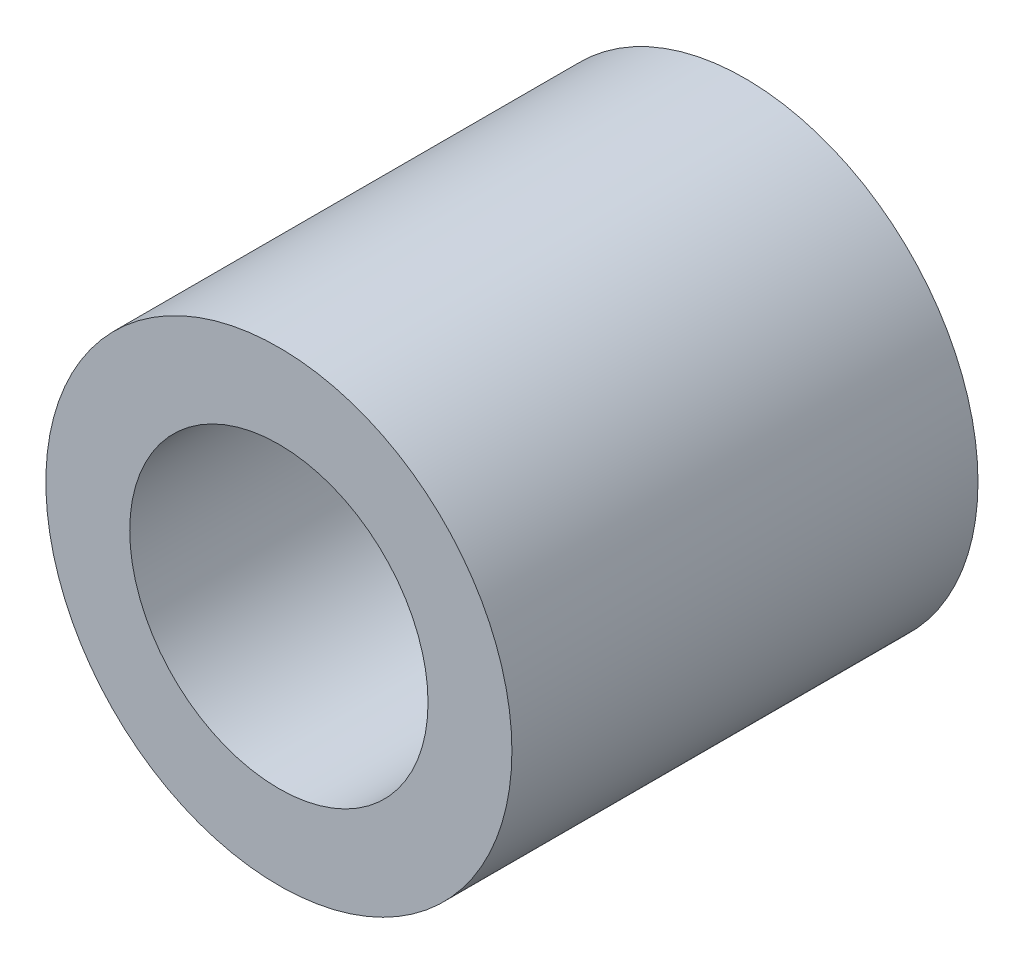
ISO-10303-21;
HEADER;
FILE_DESCRIPTION(('STEP AP214'),'2;1');
FILE_NAME('part.step','',(''),(''),'','','');
FILE_SCHEMA(('AUTOMOTIVE_DESIGN { 1 0 10303 214 1 1 1 1 }'));
ENDSEC;
DATA;
#1=APPLICATION_CONTEXT('core data for automotive mechanical design processes');
#2=APPLICATION_PROTOCOL_DEFINITION('international standard','automotive_design',2000,#1);
#3=PRODUCT_CONTEXT('',#1,'mechanical');
#4=PRODUCT('Part','Part','',(#3));
#5=PRODUCT_RELATED_PRODUCT_CATEGORY('part','',(#4));
#6=PRODUCT_DEFINITION_FORMATION('','',#4);
#7=PRODUCT_DEFINITION_CONTEXT('part definition',#1,'design');
#8=PRODUCT_DEFINITION('design','',#6,#7);
#9=PRODUCT_DEFINITION_SHAPE('','',#8);
#10=(LENGTH_UNIT() NAMED_UNIT(*) SI_UNIT(.MILLI.,.METRE.));
#11=(NAMED_UNIT(*) PLANE_ANGLE_UNIT() SI_UNIT($,.RADIAN.));
#12=(NAMED_UNIT(*) SI_UNIT($,.STERADIAN.) SOLID_ANGLE_UNIT());
#13=UNCERTAINTY_MEASURE_WITH_UNIT(LENGTH_MEASURE(1.E-05),#10,'distance_accuracy_value','');
#14=(GEOMETRIC_REPRESENTATION_CONTEXT(3) GLOBAL_UNCERTAINTY_ASSIGNED_CONTEXT((#13)) GLOBAL_UNIT_ASSIGNED_CONTEXT((#10,
#11,#12)) REPRESENTATION_CONTEXT('',''));
#15=CARTESIAN_POINT('',(0.,0.,0.));
#16=DIRECTION('',(0.,0.,1.));
#17=DIRECTION('',(1.,0.,0.));
#18=AXIS2_PLACEMENT_3D('',#15,#16,#17);
#19=CARTESIAN_POINT('',(0.,0.,5.));
#20=DIRECTION('',(0.,0.,1.));
#21=DIRECTION('',(1.,0.,0.));
#22=AXIS2_PLACEMENT_3D('',#19,#20,#21);
#23=PLANE('',#22);
#24=CARTESIAN_POINT('',(0.,0.,5.));
#25=DIRECTION('',(0.,0.,1.));
#26=DIRECTION('',(1.,0.,0.));
#27=AXIS2_PLACEMENT_3D('',#24,#25,#26);
#28=CIRCLE('',#27,2.5);
#29=CARTESIAN_POINT('',(2.5,0.,5.));
#30=VERTEX_POINT('',#29);
#31=EDGE_CURVE('E10',#30,#30,#28,.T.);
#32=ORIENTED_EDGE('',*,*,#31,.T.);
#33=EDGE_LOOP('',(#32));
#34=FACE_BOUND('',#33,.T.);
#35=CARTESIAN_POINT('',(0.,0.,5.));
#36=DIRECTION('',(0.,0.,1.));
#37=DIRECTION('',(1.,0.,0.));
#38=AXIS2_PLACEMENT_3D('',#35,#36,#37);
#39=CIRCLE('',#38,1.6);
#40=CARTESIAN_POINT('',(1.6,0.,5.));
#41=VERTEX_POINT('',#40);
#42=EDGE_CURVE('E58',#41,#41,#39,.T.);
#43=ORIENTED_EDGE('',*,*,#42,.F.);
#44=EDGE_LOOP('',(#43));
#45=FACE_BOUND('',#44,.T.);
#46=ADVANCED_FACE('F45',(#34,#45),#23,.T.);
#47=CARTESIAN_POINT('',(0.,0.,0.));
#48=DIRECTION('',(0.,0.,1.));
#49=DIRECTION('',(1.,0.,0.));
#50=AXIS2_PLACEMENT_3D('',#47,#48,#49);
#51=PLANE('',#50);
#52=CARTESIAN_POINT('',(0.,0.,0.));
#53=DIRECTION('',(0.,0.,1.));
#54=DIRECTION('',(1.,0.,0.));
#55=AXIS2_PLACEMENT_3D('',#52,#53,#54);
#56=CIRCLE('',#55,2.5);
#57=CARTESIAN_POINT('',(2.5,0.,0.));
#58=VERTEX_POINT('',#57);
#59=EDGE_CURVE('E49',#58,#58,#56,.T.);
#60=ORIENTED_EDGE('',*,*,#59,.F.);
#61=EDGE_LOOP('',(#60));
#62=FACE_BOUND('',#61,.T.);
#63=CARTESIAN_POINT('',(0.,0.,0.));
#64=DIRECTION('',(0.,0.,1.));
#65=DIRECTION('',(1.,0.,0.));
#66=AXIS2_PLACEMENT_3D('',#63,#64,#65);
#67=CIRCLE('',#66,1.6);
#68=CARTESIAN_POINT('',(1.6,0.,0.));
#69=VERTEX_POINT('',#68);
#70=EDGE_CURVE('E60',#69,#69,#67,.T.);
#71=ORIENTED_EDGE('',*,*,#70,.T.);
#72=EDGE_LOOP('',(#71));
#73=FACE_BOUND('',#72,.T.);
#74=ADVANCED_FACE('F72',(#62,#73),#51,.F.);
#75=CARTESIAN_POINT('',(0.,0.,5.));
#76=DIRECTION('',(0.,0.,-1.));
#77=DIRECTION('',(-1.,0.,0.));
#78=AXIS2_PLACEMENT_3D('',#75,#76,#77);
#79=CYLINDRICAL_SURFACE('',#78,2.5);
#80=ORIENTED_EDGE('',*,*,#31,.F.);
#81=EDGE_LOOP('',(#80));
#82=FACE_BOUND('',#81,.T.);
#83=ORIENTED_EDGE('',*,*,#59,.T.);
#84=EDGE_LOOP('',(#83));
#85=FACE_BOUND('',#84,.T.);
#86=ADVANCED_FACE('F47',(#82,#85),#79,.T.);
#87=CARTESIAN_POINT('',(0.,0.,5.));
#88=DIRECTION('',(0.,0.,-1.));
#89=DIRECTION('',(-1.,0.,0.));
#90=AXIS2_PLACEMENT_3D('',#87,#88,#89);
#91=CYLINDRICAL_SURFACE('',#90,1.6);
#92=ORIENTED_EDGE('',*,*,#42,.T.);
#93=EDGE_LOOP('',(#92));
#94=FACE_BOUND('',#93,.T.);
#95=ORIENTED_EDGE('',*,*,#70,.F.);
#96=EDGE_LOOP('',(#95));
#97=FACE_BOUND('',#96,.T.);
#98=ADVANCED_FACE('F68',(#94,#97),#91,.F.);
#99=CLOSED_SHELL('',(#46,#74,#86,#98));
#100=MANIFOLD_SOLID_BREP('B2',#99);
#101=ADVANCED_BREP_SHAPE_REPRESENTATION('',(#18,#100),#14);
#102=SHAPE_DEFINITION_REPRESENTATION(#9,#101);
ENDSEC;
END-ISO-10303-21;
